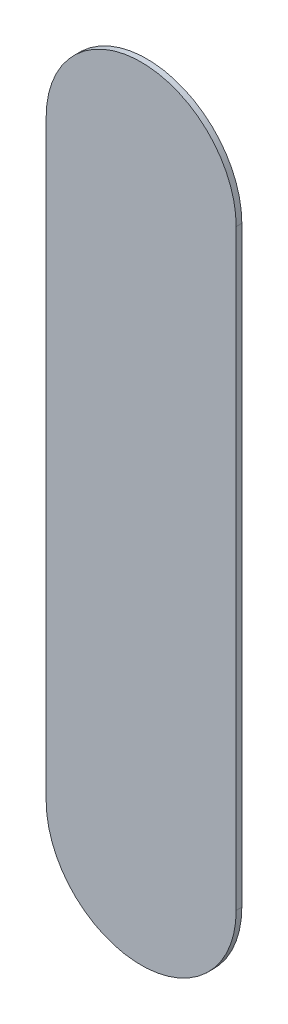
ISO-10303-21;
HEADER;
FILE_DESCRIPTION(('STEP AP214'),'2;1');
FILE_NAME('part.step','',(''),(''),'','','');
FILE_SCHEMA(('AUTOMOTIVE_DESIGN { 1 0 10303 214 1 1 1 1 }'));
ENDSEC;
DATA;
#1=APPLICATION_CONTEXT('core data for automotive mechanical design processes');
#2=APPLICATION_PROTOCOL_DEFINITION('international standard','automotive_design',2000,#1);
#3=PRODUCT_CONTEXT('',#1,'mechanical');
#4=PRODUCT('Part','Part','',(#3));
#5=PRODUCT_RELATED_PRODUCT_CATEGORY('part','',(#4));
#6=PRODUCT_DEFINITION_FORMATION('','',#4);
#7=PRODUCT_DEFINITION_CONTEXT('part definition',#1,'design');
#8=PRODUCT_DEFINITION('design','',#6,#7);
#9=PRODUCT_DEFINITION_SHAPE('','',#8);
#10=(LENGTH_UNIT() NAMED_UNIT(*) SI_UNIT(.MILLI.,.METRE.));
#11=(NAMED_UNIT(*) PLANE_ANGLE_UNIT() SI_UNIT($,.RADIAN.));
#12=(NAMED_UNIT(*) SI_UNIT($,.STERADIAN.) SOLID_ANGLE_UNIT());
#13=UNCERTAINTY_MEASURE_WITH_UNIT(LENGTH_MEASURE(1.E-05),#10,'distance_accuracy_value','');
#14=(GEOMETRIC_REPRESENTATION_CONTEXT(3) GLOBAL_UNCERTAINTY_ASSIGNED_CONTEXT((#13)) GLOBAL_UNIT_ASSIGNED_CONTEXT((#10,
#11,#12)) REPRESENTATION_CONTEXT('',''));
#15=CARTESIAN_POINT('',(0.,0.,0.));
#16=DIRECTION('',(0.,0.,1.));
#17=DIRECTION('',(1.,0.,0.));
#18=AXIS2_PLACEMENT_3D('',#15,#16,#17);
#19=CARTESIAN_POINT('',(84.49999864,101.13019398,0.));
#20=DIRECTION('',(-1.,0.,0.));
#21=DIRECTION('',(0.,1.,0.));
#22=AXIS2_PLACEMENT_3D('',#19,#20,#21);
#23=PLANE('',#22);
#24=DIRECTION('',(0.,1.,0.));
#25=VECTOR('',#24,1.);
#26=CARTESIAN_POINT('',(84.49999864,101.13019398,0.03556));
#27=LINE('',#26,#25);
#28=CARTESIAN_POINT('',(84.49999864,101.13019398,0.03556));
#29=VERTEX_POINT('',#28);
#30=CARTESIAN_POINT('',(84.49999864,104.86980042,0.03556));
#31=VERTEX_POINT('',#30);
#32=EDGE_CURVE('E11',#29,#31,#27,.T.);
#33=ORIENTED_EDGE('',*,*,#32,.F.);
#34=DIRECTION('',(0.,0.,1.));
#35=VECTOR('',#34,1.);
#36=CARTESIAN_POINT('',(84.49999864,101.13019398,0.));
#37=LINE('',#36,#35);
#38=CARTESIAN_POINT('',(84.49999864,101.13019398,0.));
#39=VERTEX_POINT('',#38);
#40=EDGE_CURVE('E24',#39,#29,#37,.T.);
#41=ORIENTED_EDGE('',*,*,#40,.F.);
#42=DIRECTION('',(0.,1.,0.));
#43=VECTOR('',#42,1.);
#44=CARTESIAN_POINT('',(84.49999864,101.13019398,0.));
#45=LINE('',#44,#43);
#46=CARTESIAN_POINT('',(84.49999864,104.86980042,0.));
#47=VERTEX_POINT('',#46);
#48=EDGE_CURVE('E75',#39,#47,#45,.T.);
#49=ORIENTED_EDGE('',*,*,#48,.T.);
#50=DIRECTION('',(0.,0.,1.));
#51=VECTOR('',#50,1.);
#52=CARTESIAN_POINT('',(84.49999864,104.86980042,0.));
#53=LINE('',#52,#51);
#54=EDGE_CURVE('E37',#47,#31,#53,.T.);
#55=ORIENTED_EDGE('',*,*,#54,.T.);
#56=EDGE_LOOP('',(#33,#41,#49,#55));
#57=FACE_BOUND('',#56,.T.);
#58=ADVANCED_FACE('F17',(#57),#23,.F.);
#59=CARTESIAN_POINT('',(83.89999984,104.86980042,0.));
#60=DIRECTION('',(0.,0.,-1.));
#61=DIRECTION('',(1.,0.,0.));
#62=AXIS2_PLACEMENT_3D('',#59,#60,#61);
#63=CYLINDRICAL_SURFACE('',#62,0.599998799999995);
#64=CARTESIAN_POINT('',(83.89999984,104.86980042,0.03556));
#65=DIRECTION('',(0.,0.,1.));
#66=DIRECTION('',(1.,0.,0.));
#67=AXIS2_PLACEMENT_3D('',#64,#65,#66);
#68=CIRCLE('',#67,0.599998799999995);
#69=CARTESIAN_POINT('',(83.30000104,104.86980042,0.03556));
#70=VERTEX_POINT('',#69);
#71=EDGE_CURVE('E83',#31,#70,#68,.T.);
#72=ORIENTED_EDGE('',*,*,#71,.F.);
#73=ORIENTED_EDGE('',*,*,#54,.F.);
#74=CARTESIAN_POINT('',(83.89999984,104.86980042,0.));
#75=DIRECTION('',(0.,0.,1.));
#76=DIRECTION('',(1.,0.,0.));
#77=AXIS2_PLACEMENT_3D('',#74,#75,#76);
#78=CIRCLE('',#77,0.599998799999995);
#79=CARTESIAN_POINT('',(83.30000104,104.86980042,0.));
#80=VERTEX_POINT('',#79);
#81=EDGE_CURVE('E81',#47,#80,#78,.T.);
#82=ORIENTED_EDGE('',*,*,#81,.T.);
#83=DIRECTION('',(0.,0.,1.));
#84=VECTOR('',#83,1.);
#85=CARTESIAN_POINT('',(83.30000104,104.86980042,0.));
#86=LINE('',#85,#84);
#87=EDGE_CURVE('E67',#80,#70,#86,.T.);
#88=ORIENTED_EDGE('',*,*,#87,.T.);
#89=EDGE_LOOP('',(#72,#73,#82,#88));
#90=FACE_BOUND('',#89,.T.);
#91=ADVANCED_FACE('F89',(#90),#63,.T.);
#92=CARTESIAN_POINT('',(83.30000104,104.86980042,0.));
#93=DIRECTION('',(1.,0.,0.));
#94=DIRECTION('',(0.,-1.,0.));
#95=AXIS2_PLACEMENT_3D('',#92,#93,#94);
#96=PLANE('',#95);
#97=DIRECTION('',(0.,-1.,0.));
#98=VECTOR('',#97,1.);
#99=CARTESIAN_POINT('',(83.30000104,104.86980042,0.03556));
#100=LINE('',#99,#98);
#101=CARTESIAN_POINT('',(83.30000104,101.13019398,0.03556));
#102=VERTEX_POINT('',#101);
#103=EDGE_CURVE('E71',#70,#102,#100,.T.);
#104=ORIENTED_EDGE('',*,*,#103,.F.);
#105=ORIENTED_EDGE('',*,*,#87,.F.);
#106=DIRECTION('',(0.,-1.,0.));
#107=VECTOR('',#106,1.);
#108=CARTESIAN_POINT('',(83.30000104,104.86980042,0.));
#109=LINE('',#108,#107);
#110=CARTESIAN_POINT('',(83.30000104,101.13019398,0.));
#111=VERTEX_POINT('',#110);
#112=EDGE_CURVE('E63',#80,#111,#109,.T.);
#113=ORIENTED_EDGE('',*,*,#112,.T.);
#114=DIRECTION('',(0.,0.,1.));
#115=VECTOR('',#114,1.);
#116=CARTESIAN_POINT('',(83.30000104,101.13019398,0.));
#117=LINE('',#116,#115);
#118=EDGE_CURVE('E53',#111,#102,#117,.T.);
#119=ORIENTED_EDGE('',*,*,#118,.T.);
#120=EDGE_LOOP('',(#104,#105,#113,#119));
#121=FACE_BOUND('',#120,.T.);
#122=ADVANCED_FACE('F66',(#121),#96,.F.);
#123=CARTESIAN_POINT('',(83.89999984,101.13019398,0.));
#124=DIRECTION('',(0.,0.,-1.));
#125=DIRECTION('',(-1.,0.,0.));
#126=AXIS2_PLACEMENT_3D('',#123,#124,#125);
#127=CYLINDRICAL_SURFACE('',#126,0.59999879999999);
#128=CARTESIAN_POINT('',(83.89999984,101.13019398,0.03556));
#129=DIRECTION('',(0.,0.,1.));
#130=DIRECTION('',(-1.,0.,0.));
#131=AXIS2_PLACEMENT_3D('',#128,#129,#130);
#132=CIRCLE('',#131,0.59999879999999);
#133=EDGE_CURVE('E59',#102,#29,#132,.T.);
#134=ORIENTED_EDGE('',*,*,#133,.F.);
#135=ORIENTED_EDGE('',*,*,#118,.F.);
#136=CARTESIAN_POINT('',(83.89999984,101.13019398,0.));
#137=DIRECTION('',(0.,0.,1.));
#138=DIRECTION('',(-1.,0.,0.));
#139=AXIS2_PLACEMENT_3D('',#136,#137,#138);
#140=CIRCLE('',#139,0.59999879999999);
#141=EDGE_CURVE('E57',#111,#39,#140,.T.);
#142=ORIENTED_EDGE('',*,*,#141,.T.);
#143=ORIENTED_EDGE('',*,*,#40,.T.);
#144=EDGE_LOOP('',(#134,#135,#142,#143));
#145=FACE_BOUND('',#144,.T.);
#146=ADVANCED_FACE('F55',(#145),#127,.T.);
#147=CARTESIAN_POINT('',(84.49999864,101.13019398,0.));
#148=DIRECTION('',(0.,0.,-1.));
#149=DIRECTION('',(-1.,0.,0.));
#150=AXIS2_PLACEMENT_3D('',#147,#148,#149);
#151=PLANE('',#150);
#152=ORIENTED_EDGE('',*,*,#141,.F.);
#153=ORIENTED_EDGE('',*,*,#112,.F.);
#154=ORIENTED_EDGE('',*,*,#81,.F.);
#155=ORIENTED_EDGE('',*,*,#48,.F.);
#156=EDGE_LOOP('',(#152,#153,#154,#155));
#157=FACE_BOUND('',#156,.T.);
#158=ADVANCED_FACE('F74',(#157),#151,.T.);
#159=CARTESIAN_POINT('',(84.49999864,101.13019398,0.03556));
#160=DIRECTION('',(0.,0.,-1.));
#161=DIRECTION('',(-1.,0.,0.));
#162=AXIS2_PLACEMENT_3D('',#159,#160,#161);
#163=PLANE('',#162);
#164=ORIENTED_EDGE('',*,*,#32,.T.);
#165=ORIENTED_EDGE('',*,*,#71,.T.);
#166=ORIENTED_EDGE('',*,*,#103,.T.);
#167=ORIENTED_EDGE('',*,*,#133,.T.);
#168=EDGE_LOOP('',(#164,#165,#166,#167));
#169=FACE_BOUND('',#168,.T.);
#170=ADVANCED_FACE('F91',(#169),#163,.F.);
#171=CLOSED_SHELL('',(#58,#91,#122,#146,#158,#170));
#172=MANIFOLD_SOLID_BREP('B1',#171);
#173=ADVANCED_BREP_SHAPE_REPRESENTATION('',(#18,#172),#14);
#174=SHAPE_DEFINITION_REPRESENTATION(#9,#173);
ENDSEC;
END-ISO-10303-21;
